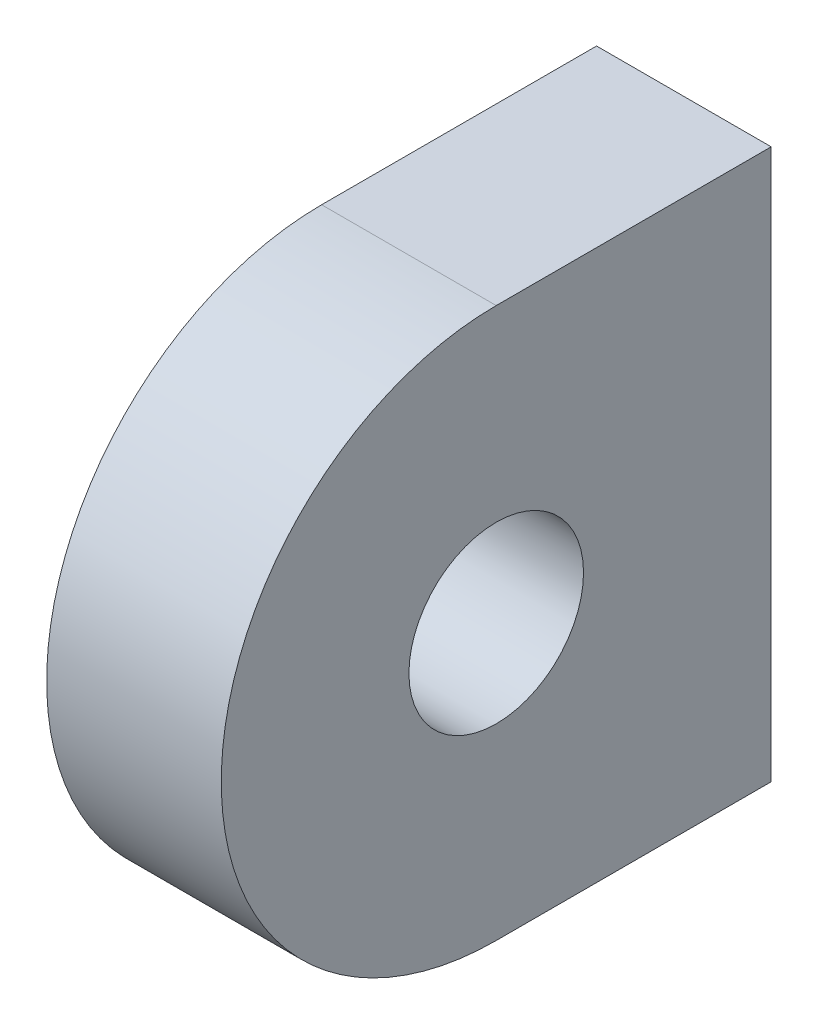
ISO-10303-21;
HEADER;
FILE_DESCRIPTION(('STEP AP214'),'2;1');
FILE_NAME('part.step','',(''),(''),'','','');
FILE_SCHEMA(('AUTOMOTIVE_DESIGN { 1 0 10303 214 1 1 1 1 }'));
ENDSEC;
DATA;
#1=APPLICATION_CONTEXT('core data for automotive mechanical design processes');
#2=APPLICATION_PROTOCOL_DEFINITION('international standard','automotive_design',2000,#1);
#3=PRODUCT_CONTEXT('',#1,'mechanical');
#4=PRODUCT('Part','Part','',(#3));
#5=PRODUCT_RELATED_PRODUCT_CATEGORY('part','',(#4));
#6=PRODUCT_DEFINITION_FORMATION('','',#4);
#7=PRODUCT_DEFINITION_CONTEXT('part definition',#1,'design');
#8=PRODUCT_DEFINITION('design','',#6,#7);
#9=PRODUCT_DEFINITION_SHAPE('','',#8);
#10=(LENGTH_UNIT() NAMED_UNIT(*) SI_UNIT(.MILLI.,.METRE.));
#11=(NAMED_UNIT(*) PLANE_ANGLE_UNIT() SI_UNIT($,.RADIAN.));
#12=(NAMED_UNIT(*) SI_UNIT($,.STERADIAN.) SOLID_ANGLE_UNIT());
#13=UNCERTAINTY_MEASURE_WITH_UNIT(LENGTH_MEASURE(1.E-05),#10,'distance_accuracy_value','');
#14=(GEOMETRIC_REPRESENTATION_CONTEXT(3) GLOBAL_UNCERTAINTY_ASSIGNED_CONTEXT((#13)) GLOBAL_UNIT_ASSIGNED_CONTEXT((#10,
#11,#12)) REPRESENTATION_CONTEXT('',''));
#15=CARTESIAN_POINT('',(0.,0.,0.));
#16=DIRECTION('',(0.,0.,1.));
#17=DIRECTION('',(1.,0.,0.));
#18=AXIS2_PLACEMENT_3D('',#15,#16,#17);
#19=CARTESIAN_POINT('',(6.35,0.,0.));
#20=DIRECTION('',(1.,0.,0.));
#21=DIRECTION('',(0.,0.,-1.));
#22=AXIS2_PLACEMENT_3D('',#19,#20,#21);
#23=PLANE('',#22);
#24=CARTESIAN_POINT('',(6.35,0.,0.));
#25=DIRECTION('',(1.,0.,0.));
#26=DIRECTION('',(0.,0.,-1.));
#27=AXIS2_PLACEMENT_3D('',#24,#25,#26);
#28=CIRCLE('',#27,10.);
#29=CARTESIAN_POINT('',(6.35,10.,0.));
#30=VERTEX_POINT('',#29);
#31=CARTESIAN_POINT('',(6.35,-10.,0.));
#32=VERTEX_POINT('',#31);
#33=EDGE_CURVE('E92',#30,#32,#28,.T.);
#34=ORIENTED_EDGE('',*,*,#33,.T.);
#35=DIRECTION('',(0.,0.,-1.));
#36=VECTOR('',#35,1.);
#37=CARTESIAN_POINT('',(6.35,-10.,-10.));
#38=LINE('',#37,#36);
#39=CARTESIAN_POINT('',(6.35,-10.,-10.));
#40=VERTEX_POINT('',#39);
#41=EDGE_CURVE('E87',#32,#40,#38,.T.);
#42=ORIENTED_EDGE('',*,*,#41,.T.);
#43=DIRECTION('',(0.,1.,0.));
#44=VECTOR('',#43,1.);
#45=CARTESIAN_POINT('',(6.35,10.,-10.));
#46=LINE('',#45,#44);
#47=CARTESIAN_POINT('',(6.35,10.,-10.));
#48=VERTEX_POINT('',#47);
#49=EDGE_CURVE('E90',#40,#48,#46,.T.);
#50=ORIENTED_EDGE('',*,*,#49,.T.);
#51=DIRECTION('',(0.,0.,1.));
#52=VECTOR('',#51,1.);
#53=CARTESIAN_POINT('',(6.35,10.,0.));
#54=LINE('',#53,#52);
#55=EDGE_CURVE('E57',#48,#30,#54,.T.);
#56=ORIENTED_EDGE('',*,*,#55,.T.);
#57=EDGE_LOOP('',(#34,#42,#50,#56));
#58=FACE_BOUND('',#57,.T.);
#59=CARTESIAN_POINT('',(6.35,0.,0.));
#60=DIRECTION('',(1.,0.,0.));
#61=DIRECTION('',(0.,0.,-1.));
#62=AXIS2_PLACEMENT_3D('',#59,#60,#61);
#63=CIRCLE('',#62,3.175);
#64=CARTESIAN_POINT('',(6.35,0.,-3.175));
#65=VERTEX_POINT('',#64);
#66=EDGE_CURVE('E112',#65,#65,#63,.T.);
#67=ORIENTED_EDGE('',*,*,#66,.F.);
#68=EDGE_LOOP('',(#67));
#69=FACE_BOUND('',#68,.T.);
#70=ADVANCED_FACE('F39',(#58,#69),#23,.T.);
#71=CARTESIAN_POINT('',(0.,0.,0.));
#72=DIRECTION('',(1.,0.,0.));
#73=DIRECTION('',(0.,0.,-1.));
#74=AXIS2_PLACEMENT_3D('',#71,#72,#73);
#75=PLANE('',#74);
#76=CARTESIAN_POINT('',(0.,0.,0.));
#77=DIRECTION('',(1.,0.,0.));
#78=DIRECTION('',(0.,0.,-1.));
#79=AXIS2_PLACEMENT_3D('',#76,#77,#78);
#80=CIRCLE('',#79,10.);
#81=CARTESIAN_POINT('',(0.,10.,0.));
#82=VERTEX_POINT('',#81);
#83=CARTESIAN_POINT('',(0.,-10.,0.));
#84=VERTEX_POINT('',#83);
#85=EDGE_CURVE('E108',#82,#84,#80,.T.);
#86=ORIENTED_EDGE('',*,*,#85,.F.);
#87=DIRECTION('',(0.,0.,1.));
#88=VECTOR('',#87,1.);
#89=CARTESIAN_POINT('',(0.,10.,0.));
#90=LINE('',#89,#88);
#91=CARTESIAN_POINT('',(0.,10.,-10.));
#92=VERTEX_POINT('',#91);
#93=EDGE_CURVE('E80',#92,#82,#90,.T.);
#94=ORIENTED_EDGE('',*,*,#93,.F.);
#95=DIRECTION('',(0.,1.,0.));
#96=VECTOR('',#95,1.);
#97=CARTESIAN_POINT('',(0.,10.,-10.));
#98=LINE('',#97,#96);
#99=CARTESIAN_POINT('',(0.,-10.,-10.));
#100=VERTEX_POINT('',#99);
#101=EDGE_CURVE('E74',#100,#92,#98,.T.);
#102=ORIENTED_EDGE('',*,*,#101,.F.);
#103=DIRECTION('',(0.,0.,-1.));
#104=VECTOR('',#103,1.);
#105=CARTESIAN_POINT('',(0.,-10.,-10.));
#106=LINE('',#105,#104);
#107=EDGE_CURVE('E97',#84,#100,#106,.T.);
#108=ORIENTED_EDGE('',*,*,#107,.F.);
#109=EDGE_LOOP('',(#86,#94,#102,#108));
#110=FACE_BOUND('',#109,.T.);
#111=CARTESIAN_POINT('',(0.,0.,0.));
#112=DIRECTION('',(1.,0.,0.));
#113=DIRECTION('',(0.,0.,-1.));
#114=AXIS2_PLACEMENT_3D('',#111,#112,#113);
#115=CIRCLE('',#114,3.175);
#116=CARTESIAN_POINT('',(0.,0.,-3.175));
#117=VERTEX_POINT('',#116);
#118=EDGE_CURVE('E130',#117,#117,#115,.T.);
#119=ORIENTED_EDGE('',*,*,#118,.T.);
#120=EDGE_LOOP('',(#119));
#121=FACE_BOUND('',#120,.T.);
#122=ADVANCED_FACE('F125',(#110,#121),#75,.F.);
#123=CARTESIAN_POINT('',(6.35,0.,0.));
#124=DIRECTION('',(-1.,0.,0.));
#125=DIRECTION('',(0.,0.,1.));
#126=AXIS2_PLACEMENT_3D('',#123,#124,#125);
#127=CYLINDRICAL_SURFACE('',#126,10.);
#128=ORIENTED_EDGE('',*,*,#85,.T.);
#129=DIRECTION('',(-1.,0.,0.));
#130=VECTOR('',#129,1.);
#131=CARTESIAN_POINT('',(6.35,-10.,0.));
#132=LINE('',#131,#130);
#133=EDGE_CURVE('E11',#32,#84,#132,.T.);
#134=ORIENTED_EDGE('',*,*,#133,.F.);
#135=ORIENTED_EDGE('',*,*,#33,.F.);
#136=DIRECTION('',(-1.,0.,0.));
#137=VECTOR('',#136,1.);
#138=CARTESIAN_POINT('',(6.35,10.,0.));
#139=LINE('',#138,#137);
#140=EDGE_CURVE('E104',#30,#82,#139,.T.);
#141=ORIENTED_EDGE('',*,*,#140,.T.);
#142=EDGE_LOOP('',(#128,#134,#135,#141));
#143=FACE_BOUND('',#142,.T.);
#144=ADVANCED_FACE('F41',(#143),#127,.T.);
#145=CARTESIAN_POINT('',(6.35,-10.,-10.));
#146=DIRECTION('',(0.,1.,0.));
#147=DIRECTION('',(0.,0.,1.));
#148=AXIS2_PLACEMENT_3D('',#145,#146,#147);
#149=PLANE('',#148);
#150=ORIENTED_EDGE('',*,*,#107,.T.);
#151=DIRECTION('',(-1.,0.,0.));
#152=VECTOR('',#151,1.);
#153=CARTESIAN_POINT('',(6.35,-10.,-10.));
#154=LINE('',#153,#152);
#155=EDGE_CURVE('E49',#40,#100,#154,.T.);
#156=ORIENTED_EDGE('',*,*,#155,.F.);
#157=ORIENTED_EDGE('',*,*,#41,.F.);
#158=ORIENTED_EDGE('',*,*,#133,.T.);
#159=EDGE_LOOP('',(#150,#156,#157,#158));
#160=FACE_BOUND('',#159,.T.);
#161=ADVANCED_FACE('F96',(#160),#149,.F.);
#162=CARTESIAN_POINT('',(6.35,10.,-10.));
#163=DIRECTION('',(0.,0.,1.));
#164=DIRECTION('',(1.,0.,0.));
#165=AXIS2_PLACEMENT_3D('',#162,#163,#164);
#166=PLANE('',#165);
#167=ORIENTED_EDGE('',*,*,#101,.T.);
#168=DIRECTION('',(-1.,0.,0.));
#169=VECTOR('',#168,1.);
#170=CARTESIAN_POINT('',(6.35,10.,-10.));
#171=LINE('',#170,#169);
#172=EDGE_CURVE('E99',#48,#92,#171,.T.);
#173=ORIENTED_EDGE('',*,*,#172,.F.);
#174=ORIENTED_EDGE('',*,*,#49,.F.);
#175=ORIENTED_EDGE('',*,*,#155,.T.);
#176=EDGE_LOOP('',(#167,#173,#174,#175));
#177=FACE_BOUND('',#176,.T.);
#178=ADVANCED_FACE('F100',(#177),#166,.F.);
#179=CARTESIAN_POINT('',(6.35,10.,0.));
#180=DIRECTION('',(0.,-1.,0.));
#181=DIRECTION('',(0.,0.,-1.));
#182=AXIS2_PLACEMENT_3D('',#179,#180,#181);
#183=PLANE('',#182);
#184=ORIENTED_EDGE('',*,*,#93,.T.);
#185=ORIENTED_EDGE('',*,*,#140,.F.);
#186=ORIENTED_EDGE('',*,*,#55,.F.);
#187=ORIENTED_EDGE('',*,*,#172,.T.);
#188=EDGE_LOOP('',(#184,#185,#186,#187));
#189=FACE_BOUND('',#188,.T.);
#190=ADVANCED_FACE('F122',(#189),#183,.F.);
#191=CARTESIAN_POINT('',(6.35,0.,0.));
#192=DIRECTION('',(-1.,0.,0.));
#193=DIRECTION('',(0.,0.,1.));
#194=AXIS2_PLACEMENT_3D('',#191,#192,#193);
#195=CYLINDRICAL_SURFACE('',#194,3.175);
#196=ORIENTED_EDGE('',*,*,#66,.T.);
#197=EDGE_LOOP('',(#196));
#198=FACE_BOUND('',#197,.T.);
#199=ORIENTED_EDGE('',*,*,#118,.F.);
#200=EDGE_LOOP('',(#199));
#201=FACE_BOUND('',#200,.T.);
#202=ADVANCED_FACE('F138',(#198,#201),#195,.F.);
#203=CLOSED_SHELL('',(#70,#122,#144,#161,#178,#190,#202));
#204=MANIFOLD_SOLID_BREP('B2',#203);
#205=ADVANCED_BREP_SHAPE_REPRESENTATION('',(#18,#204),#14);
#206=SHAPE_DEFINITION_REPRESENTATION(#9,#205);
ENDSEC;
END-ISO-10303-21;
